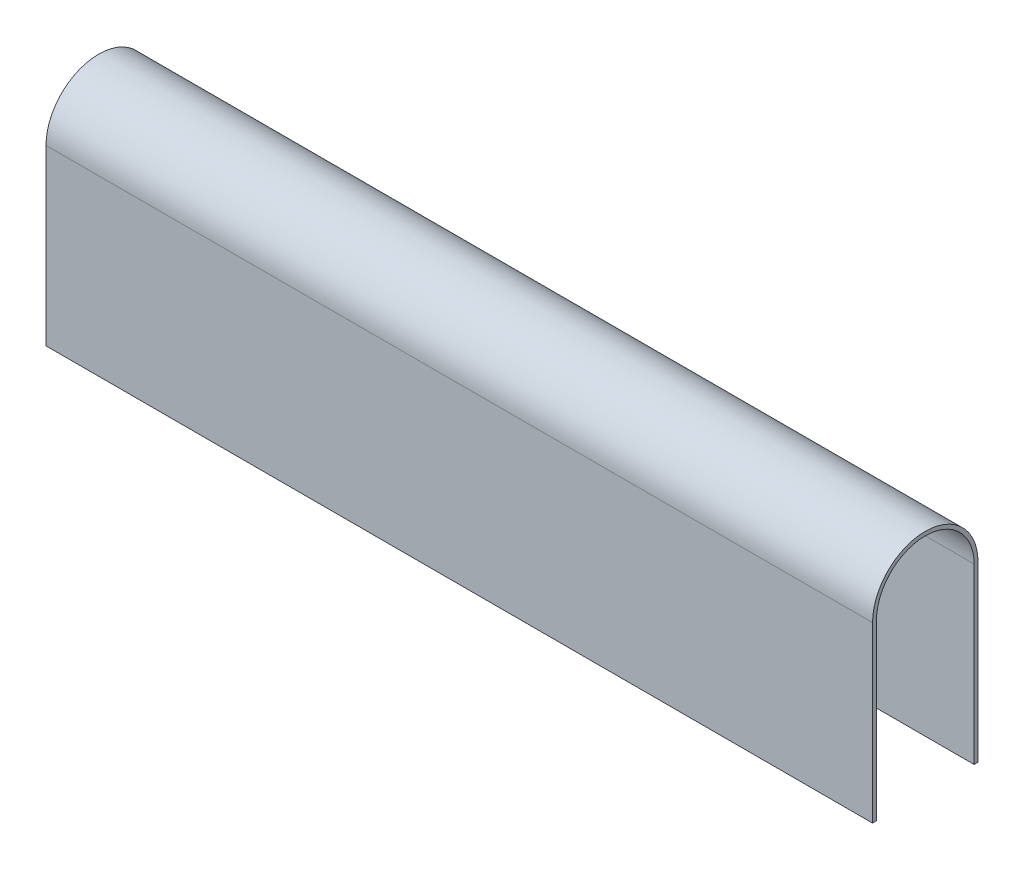
ISO-10303-21;
HEADER;
FILE_DESCRIPTION(('STEP AP214'),'2;1');
FILE_NAME('part.step','',(''),(''),'','','');
FILE_SCHEMA(('AUTOMOTIVE_DESIGN { 1 0 10303 214 1 1 1 1 }'));
ENDSEC;
DATA;
#1=APPLICATION_CONTEXT('core data for automotive mechanical design processes');
#2=APPLICATION_PROTOCOL_DEFINITION('international standard','automotive_design',2000,#1);
#3=PRODUCT_CONTEXT('',#1,'mechanical');
#4=PRODUCT('Part','Part','',(#3));
#5=PRODUCT_RELATED_PRODUCT_CATEGORY('part','',(#4));
#6=PRODUCT_DEFINITION_FORMATION('','',#4);
#7=PRODUCT_DEFINITION_CONTEXT('part definition',#1,'design');
#8=PRODUCT_DEFINITION('design','',#6,#7);
#9=PRODUCT_DEFINITION_SHAPE('','',#8);
#10=(LENGTH_UNIT() NAMED_UNIT(*) SI_UNIT(.MILLI.,.METRE.));
#11=(NAMED_UNIT(*) PLANE_ANGLE_UNIT() SI_UNIT($,.RADIAN.));
#12=(NAMED_UNIT(*) SI_UNIT($,.STERADIAN.) SOLID_ANGLE_UNIT());
#13=UNCERTAINTY_MEASURE_WITH_UNIT(LENGTH_MEASURE(1.E-05),#10,'distance_accuracy_value','');
#14=(GEOMETRIC_REPRESENTATION_CONTEXT(3) GLOBAL_UNCERTAINTY_ASSIGNED_CONTEXT((#13)) GLOBAL_UNIT_ASSIGNED_CONTEXT((#10,
#11,#12)) REPRESENTATION_CONTEXT('',''));
#15=CARTESIAN_POINT('',(0.,0.,0.));
#16=DIRECTION('',(0.,0.,1.));
#17=DIRECTION('',(1.,0.,0.));
#18=AXIS2_PLACEMENT_3D('',#15,#16,#17);
#19=CARTESIAN_POINT('',(322.5133,67.7418,9.52500000000002));
#20=DIRECTION('',(-1.,0.,0.));
#21=DIRECTION('',(0.,0.,1.));
#22=AXIS2_PLACEMENT_3D('',#19,#20,#21);
#23=CYLINDRICAL_SURFACE('',#22,19.05);
#24=CARTESIAN_POINT('',(0.,67.7418,9.52500000000002));
#25=DIRECTION('',(-1.,0.,0.));
#26=DIRECTION('',(0.,0.,-1.));
#27=AXIS2_PLACEMENT_3D('',#24,#25,#26);
#28=CIRCLE('',#27,19.05);
#29=CARTESIAN_POINT('',(0.,67.7418,28.575));
#30=VERTEX_POINT('',#29);
#31=CARTESIAN_POINT('',(0.,67.7418,-9.52499999999999));
#32=VERTEX_POINT('',#31);
#33=EDGE_CURVE('E129',#30,#32,#28,.T.);
#34=ORIENTED_EDGE('',*,*,#33,.T.);
#35=DIRECTION('',(-1.,0.,0.));
#36=VECTOR('',#35,1.);
#37=CARTESIAN_POINT('',(322.5133,67.7418,-9.52499999999999));
#38=LINE('',#37,#36);
#39=CARTESIAN_POINT('',(322.5133,67.7418,-9.52499999999999));
#40=VERTEX_POINT('',#39);
#41=EDGE_CURVE('E11',#40,#32,#38,.T.);
#42=ORIENTED_EDGE('',*,*,#41,.F.);
#43=CARTESIAN_POINT('',(322.5133,67.7418,9.52500000000002));
#44=DIRECTION('',(-1.,0.,0.));
#45=DIRECTION('',(0.,0.,-1.));
#46=AXIS2_PLACEMENT_3D('',#43,#44,#45);
#47=CIRCLE('',#46,19.05);
#48=CARTESIAN_POINT('',(322.5133,67.7418,28.575));
#49=VERTEX_POINT('',#48);
#50=EDGE_CURVE('E143',#49,#40,#47,.T.);
#51=ORIENTED_EDGE('',*,*,#50,.F.);
#52=DIRECTION('',(-1.,0.,0.));
#53=VECTOR('',#52,1.);
#54=CARTESIAN_POINT('',(322.5133,67.7418,28.575));
#55=LINE('',#54,#53);
#56=EDGE_CURVE('E125',#49,#30,#55,.T.);
#57=ORIENTED_EDGE('',*,*,#56,.T.);
#58=EDGE_LOOP('',(#34,#42,#51,#57));
#59=FACE_BOUND('',#58,.T.);
#60=ADVANCED_FACE('F33',(#59),#23,.F.);
#61=CARTESIAN_POINT('',(322.5133,67.7418,-9.52499999999999));
#62=DIRECTION('',(0.,0.,-1.));
#63=DIRECTION('',(0.,1.,0.));
#64=AXIS2_PLACEMENT_3D('',#61,#62,#63);
#65=PLANE('',#64);
#66=DIRECTION('',(0.,-1.,0.));
#67=VECTOR('',#66,1.);
#68=CARTESIAN_POINT('',(0.,67.7418,-9.52499999999999));
#69=LINE('',#68,#67);
#70=CARTESIAN_POINT('',(0.,0.,-9.525));
#71=VERTEX_POINT('',#70);
#72=EDGE_CURVE('E132',#32,#71,#69,.T.);
#73=ORIENTED_EDGE('',*,*,#72,.T.);
#74=DIRECTION('',(-1.,0.,0.));
#75=VECTOR('',#74,1.);
#76=CARTESIAN_POINT('',(322.5133,0.,-9.525));
#77=LINE('',#76,#75);
#78=CARTESIAN_POINT('',(322.5133,0.,-9.525));
#79=VERTEX_POINT('',#78);
#80=EDGE_CURVE('E41',#79,#71,#77,.T.);
#81=ORIENTED_EDGE('',*,*,#80,.F.);
#82=DIRECTION('',(0.,-1.,0.));
#83=VECTOR('',#82,1.);
#84=CARTESIAN_POINT('',(322.5133,67.7418,-9.52499999999999));
#85=LINE('',#84,#83);
#86=EDGE_CURVE('E92',#40,#79,#85,.T.);
#87=ORIENTED_EDGE('',*,*,#86,.F.);
#88=ORIENTED_EDGE('',*,*,#41,.T.);
#89=EDGE_LOOP('',(#73,#81,#87,#88));
#90=FACE_BOUND('',#89,.T.);
#91=ADVANCED_FACE('F178',(#90),#65,.F.);
#92=CARTESIAN_POINT('',(322.5133,0.,-11.049));
#93=DIRECTION('',(0.,1.,0.));
#94=DIRECTION('',(0.,0.,1.));
#95=AXIS2_PLACEMENT_3D('',#92,#93,#94);
#96=PLANE('',#95);
#97=DIRECTION('',(0.,0.,-1.));
#98=VECTOR('',#97,1.);
#99=CARTESIAN_POINT('',(0.,0.,-11.049));
#100=LINE('',#99,#98);
#101=CARTESIAN_POINT('',(0.,0.,-11.049));
#102=VERTEX_POINT('',#101);
#103=EDGE_CURVE('E134',#71,#102,#100,.T.);
#104=ORIENTED_EDGE('',*,*,#103,.T.);
#105=DIRECTION('',(-1.,0.,0.));
#106=VECTOR('',#105,1.);
#107=CARTESIAN_POINT('',(322.5133,0.,-11.049));
#108=LINE('',#107,#106);
#109=CARTESIAN_POINT('',(322.5133,0.,-11.049));
#110=VERTEX_POINT('',#109);
#111=EDGE_CURVE('E150',#110,#102,#108,.T.);
#112=ORIENTED_EDGE('',*,*,#111,.F.);
#113=DIRECTION('',(0.,0.,-1.));
#114=VECTOR('',#113,1.);
#115=CARTESIAN_POINT('',(322.5133,0.,-11.049));
#116=LINE('',#115,#114);
#117=EDGE_CURVE('E158',#79,#110,#116,.T.);
#118=ORIENTED_EDGE('',*,*,#117,.F.);
#119=ORIENTED_EDGE('',*,*,#80,.T.);
#120=EDGE_LOOP('',(#104,#112,#118,#119));
#121=FACE_BOUND('',#120,.T.);
#122=ADVANCED_FACE('F156',(#121),#96,.F.);
#123=CARTESIAN_POINT('',(322.5133,67.7418,-11.049));
#124=DIRECTION('',(0.,0.,1.));
#125=DIRECTION('',(1.,0.,0.));
#126=AXIS2_PLACEMENT_3D('',#123,#124,#125);
#127=PLANE('',#126);
#128=DIRECTION('',(0.,1.,0.));
#129=VECTOR('',#128,1.);
#130=CARTESIAN_POINT('',(0.,67.7418,-11.049));
#131=LINE('',#130,#129);
#132=CARTESIAN_POINT('',(0.,67.7418,-11.049));
#133=VERTEX_POINT('',#132);
#134=EDGE_CURVE('E136',#102,#133,#131,.T.);
#135=ORIENTED_EDGE('',*,*,#134,.T.);
#136=DIRECTION('',(-1.,0.,0.));
#137=VECTOR('',#136,1.);
#138=CARTESIAN_POINT('',(322.5133,67.7418,-11.049));
#139=LINE('',#138,#137);
#140=CARTESIAN_POINT('',(322.5133,67.7418,-11.049));
#141=VERTEX_POINT('',#140);
#142=EDGE_CURVE('E147',#141,#133,#139,.T.);
#143=ORIENTED_EDGE('',*,*,#142,.F.);
#144=DIRECTION('',(0.,1.,0.));
#145=VECTOR('',#144,1.);
#146=CARTESIAN_POINT('',(322.5133,67.7418,-11.049));
#147=LINE('',#146,#145);
#148=EDGE_CURVE('E170',#110,#141,#147,.T.);
#149=ORIENTED_EDGE('',*,*,#148,.F.);
#150=ORIENTED_EDGE('',*,*,#111,.T.);
#151=EDGE_LOOP('',(#135,#143,#149,#150));
#152=FACE_BOUND('',#151,.T.);
#153=ADVANCED_FACE('F166',(#152),#127,.F.);
#154=CARTESIAN_POINT('',(322.5133,67.7418,9.52500000000002));
#155=DIRECTION('',(-1.,0.,0.));
#156=DIRECTION('',(0.,0.,1.));
#157=AXIS2_PLACEMENT_3D('',#154,#155,#156);
#158=CYLINDRICAL_SURFACE('',#157,20.574);
#159=CARTESIAN_POINT('',(0.,67.7418,9.52500000000002));
#160=DIRECTION('',(1.,0.,0.));
#161=DIRECTION('',(0.,0.,-1.));
#162=AXIS2_PLACEMENT_3D('',#159,#160,#161);
#163=CIRCLE('',#162,20.574);
#164=CARTESIAN_POINT('',(0.,67.7418,30.099));
#165=VERTEX_POINT('',#164);
#166=EDGE_CURVE('E138',#133,#165,#163,.T.);
#167=ORIENTED_EDGE('',*,*,#166,.T.);
#168=DIRECTION('',(-1.,0.,0.));
#169=VECTOR('',#168,1.);
#170=CARTESIAN_POINT('',(322.5133,67.7418,30.099));
#171=LINE('',#170,#169);
#172=CARTESIAN_POINT('',(322.5133,67.7418,30.099));
#173=VERTEX_POINT('',#172);
#174=EDGE_CURVE('E120',#173,#165,#171,.T.);
#175=ORIENTED_EDGE('',*,*,#174,.F.);
#176=CARTESIAN_POINT('',(322.5133,67.7418,9.52500000000002));
#177=DIRECTION('',(1.,0.,0.));
#178=DIRECTION('',(0.,0.,-1.));
#179=AXIS2_PLACEMENT_3D('',#176,#177,#178);
#180=CIRCLE('',#179,20.574);
#181=EDGE_CURVE('E111',#141,#173,#180,.T.);
#182=ORIENTED_EDGE('',*,*,#181,.F.);
#183=ORIENTED_EDGE('',*,*,#142,.T.);
#184=EDGE_LOOP('',(#167,#175,#182,#183));
#185=FACE_BOUND('',#184,.T.);
#186=ADVANCED_FACE('F169',(#185),#158,.T.);
#187=CARTESIAN_POINT('',(322.5133,67.7418,30.099));
#188=DIRECTION('',(0.,0.,-1.));
#189=DIRECTION('',(-1.,0.,0.));
#190=AXIS2_PLACEMENT_3D('',#187,#188,#189);
#191=PLANE('',#190);
#192=DIRECTION('',(0.,-1.,0.));
#193=VECTOR('',#192,1.);
#194=CARTESIAN_POINT('',(0.,67.7418,30.099));
#195=LINE('',#194,#193);
#196=CARTESIAN_POINT('',(0.,0.,30.099));
#197=VERTEX_POINT('',#196);
#198=EDGE_CURVE('E119',#165,#197,#195,.T.);
#199=ORIENTED_EDGE('',*,*,#198,.T.);
#200=DIRECTION('',(-1.,0.,0.));
#201=VECTOR('',#200,1.);
#202=CARTESIAN_POINT('',(322.5133,0.,30.099));
#203=LINE('',#202,#201);
#204=CARTESIAN_POINT('',(322.5133,0.,30.099));
#205=VERTEX_POINT('',#204);
#206=EDGE_CURVE('E116',#205,#197,#203,.T.);
#207=ORIENTED_EDGE('',*,*,#206,.F.);
#208=DIRECTION('',(0.,-1.,0.));
#209=VECTOR('',#208,1.);
#210=CARTESIAN_POINT('',(322.5133,67.7418,30.099));
#211=LINE('',#210,#209);
#212=EDGE_CURVE('E105',#173,#205,#211,.T.);
#213=ORIENTED_EDGE('',*,*,#212,.F.);
#214=ORIENTED_EDGE('',*,*,#174,.T.);
#215=EDGE_LOOP('',(#199,#207,#213,#214));
#216=FACE_BOUND('',#215,.T.);
#217=ADVANCED_FACE('F117',(#216),#191,.F.);
#218=CARTESIAN_POINT('',(322.5133,0.,30.099));
#219=DIRECTION('',(0.,1.,0.));
#220=DIRECTION('',(0.,0.,1.));
#221=AXIS2_PLACEMENT_3D('',#218,#219,#220);
#222=PLANE('',#221);
#223=DIRECTION('',(0.,0.,-1.));
#224=VECTOR('',#223,1.);
#225=CARTESIAN_POINT('',(0.,0.,30.099));
#226=LINE('',#225,#224);
#227=CARTESIAN_POINT('',(0.,0.,28.575));
#228=VERTEX_POINT('',#227);
#229=EDGE_CURVE('E78',#197,#228,#226,.T.);
#230=ORIENTED_EDGE('',*,*,#229,.T.);
#231=DIRECTION('',(-1.,0.,0.));
#232=VECTOR('',#231,1.);
#233=CARTESIAN_POINT('',(322.5133,0.,28.575));
#234=LINE('',#233,#232);
#235=CARTESIAN_POINT('',(322.5133,0.,28.575));
#236=VERTEX_POINT('',#235);
#237=EDGE_CURVE('E121',#236,#228,#234,.T.);
#238=ORIENTED_EDGE('',*,*,#237,.F.);
#239=DIRECTION('',(0.,0.,-1.));
#240=VECTOR('',#239,1.);
#241=CARTESIAN_POINT('',(322.5133,0.,30.099));
#242=LINE('',#241,#240);
#243=EDGE_CURVE('E109',#205,#236,#242,.T.);
#244=ORIENTED_EDGE('',*,*,#243,.F.);
#245=ORIENTED_EDGE('',*,*,#206,.T.);
#246=EDGE_LOOP('',(#230,#238,#244,#245));
#247=FACE_BOUND('',#246,.T.);
#248=ADVANCED_FACE('F123',(#247),#222,.F.);
#249=CARTESIAN_POINT('',(322.5133,67.7418,28.575));
#250=DIRECTION('',(0.,0.,1.));
#251=DIRECTION('',(0.,-1.,0.));
#252=AXIS2_PLACEMENT_3D('',#249,#250,#251);
#253=PLANE('',#252);
#254=DIRECTION('',(0.,1.,0.));
#255=VECTOR('',#254,1.);
#256=CARTESIAN_POINT('',(0.,67.7418,28.575));
#257=LINE('',#256,#255);
#258=EDGE_CURVE('E84',#228,#30,#257,.T.);
#259=ORIENTED_EDGE('',*,*,#258,.T.);
#260=ORIENTED_EDGE('',*,*,#56,.F.);
#261=DIRECTION('',(0.,1.,0.));
#262=VECTOR('',#261,1.);
#263=CARTESIAN_POINT('',(322.5133,67.7418,28.575));
#264=LINE('',#263,#262);
#265=EDGE_CURVE('E49',#236,#49,#264,.T.);
#266=ORIENTED_EDGE('',*,*,#265,.F.);
#267=ORIENTED_EDGE('',*,*,#237,.T.);
#268=EDGE_LOOP('',(#259,#260,#266,#267));
#269=FACE_BOUND('',#268,.T.);
#270=ADVANCED_FACE('F194',(#269),#253,.F.);
#271=CARTESIAN_POINT('',(322.5133,67.7418,9.52500000000002));
#272=DIRECTION('',(1.,0.,0.));
#273=DIRECTION('',(0.,0.,-1.));
#274=AXIS2_PLACEMENT_3D('',#271,#272,#273);
#275=PLANE('',#274);
#276=ORIENTED_EDGE('',*,*,#50,.T.);
#277=ORIENTED_EDGE('',*,*,#86,.T.);
#278=ORIENTED_EDGE('',*,*,#117,.T.);
#279=ORIENTED_EDGE('',*,*,#148,.T.);
#280=ORIENTED_EDGE('',*,*,#181,.T.);
#281=ORIENTED_EDGE('',*,*,#212,.T.);
#282=ORIENTED_EDGE('',*,*,#243,.T.);
#283=ORIENTED_EDGE('',*,*,#265,.T.);
#284=EDGE_LOOP('',(#276,#277,#278,#279,#280,#281,#282,#283));
#285=FACE_BOUND('',#284,.T.);
#286=ADVANCED_FACE('F107',(#285),#275,.T.);
#287=CARTESIAN_POINT('',(0.,67.7418,9.52500000000002));
#288=DIRECTION('',(1.,0.,0.));
#289=DIRECTION('',(0.,0.,-1.));
#290=AXIS2_PLACEMENT_3D('',#287,#288,#289);
#291=PLANE('',#290);
#292=ORIENTED_EDGE('',*,*,#33,.F.);
#293=ORIENTED_EDGE('',*,*,#258,.F.);
#294=ORIENTED_EDGE('',*,*,#229,.F.);
#295=ORIENTED_EDGE('',*,*,#198,.F.);
#296=ORIENTED_EDGE('',*,*,#166,.F.);
#297=ORIENTED_EDGE('',*,*,#134,.F.);
#298=ORIENTED_EDGE('',*,*,#103,.F.);
#299=ORIENTED_EDGE('',*,*,#72,.F.);
#300=EDGE_LOOP('',(#292,#293,#294,#295,#296,#297,#298,#299));
#301=FACE_BOUND('',#300,.T.);
#302=ADVANCED_FACE('F162',(#301),#291,.F.);
#303=CLOSED_SHELL('',(#60,#91,#122,#153,#186,#217,#248,#270,#286,#302));
#304=MANIFOLD_SOLID_BREP('B2',#303);
#305=ADVANCED_BREP_SHAPE_REPRESENTATION('',(#18,#304),#14);
#306=SHAPE_DEFINITION_REPRESENTATION(#9,#305);
ENDSEC;
END-ISO-10303-21;
